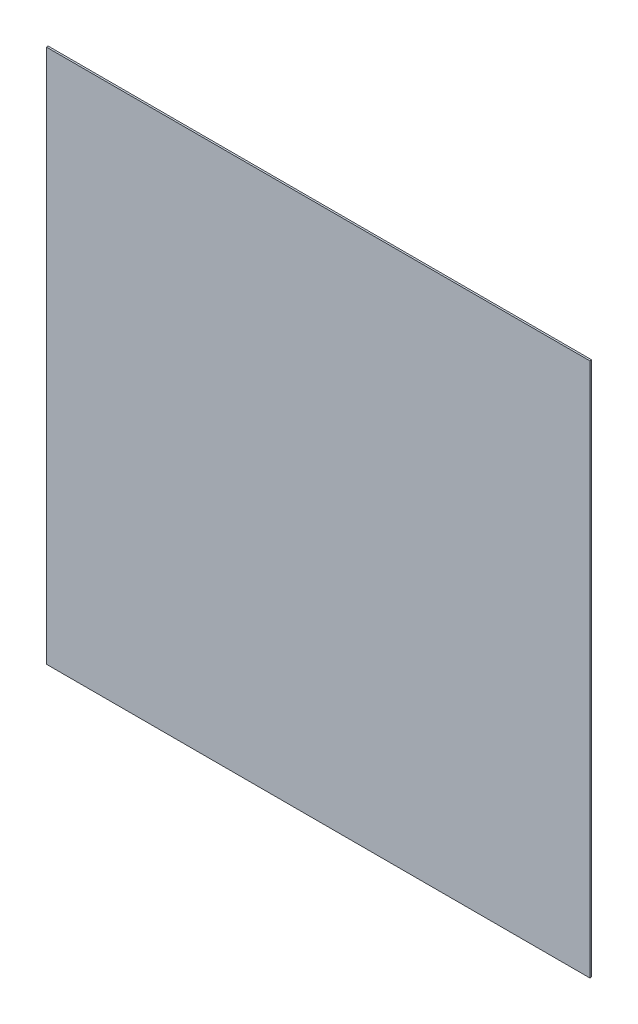
ISO-10303-21;
HEADER;
FILE_DESCRIPTION(('STEP AP214'),'2;1');
FILE_NAME('part.step','',(''),(''),'','','');
FILE_SCHEMA(('AUTOMOTIVE_DESIGN { 1 0 10303 214 1 1 1 1 }'));
ENDSEC;
DATA;
#1=APPLICATION_CONTEXT('core data for automotive mechanical design processes');
#2=APPLICATION_PROTOCOL_DEFINITION('international standard','automotive_design',2000,#1);
#3=PRODUCT_CONTEXT('',#1,'mechanical');
#4=PRODUCT('Part','Part','',(#3));
#5=PRODUCT_RELATED_PRODUCT_CATEGORY('part','',(#4));
#6=PRODUCT_DEFINITION_FORMATION('','',#4);
#7=PRODUCT_DEFINITION_CONTEXT('part definition',#1,'design');
#8=PRODUCT_DEFINITION('design','',#6,#7);
#9=PRODUCT_DEFINITION_SHAPE('','',#8);
#10=(LENGTH_UNIT() NAMED_UNIT(*) SI_UNIT(.MILLI.,.METRE.));
#11=(NAMED_UNIT(*) PLANE_ANGLE_UNIT() SI_UNIT($,.RADIAN.));
#12=(NAMED_UNIT(*) SI_UNIT($,.STERADIAN.) SOLID_ANGLE_UNIT());
#13=UNCERTAINTY_MEASURE_WITH_UNIT(LENGTH_MEASURE(1.E-05),#10,'distance_accuracy_value','');
#14=(GEOMETRIC_REPRESENTATION_CONTEXT(3) GLOBAL_UNCERTAINTY_ASSIGNED_CONTEXT((#13)) GLOBAL_UNIT_ASSIGNED_CONTEXT((#10,
#11,#12)) REPRESENTATION_CONTEXT('',''));
#15=CARTESIAN_POINT('',(0.,0.,0.));
#16=DIRECTION('',(0.,0.,1.));
#17=DIRECTION('',(1.,0.,0.));
#18=AXIS2_PLACEMENT_3D('',#15,#16,#17);
#19=CARTESIAN_POINT('',(0.,0.,2.));
#20=DIRECTION('',(1.,0.,0.));
#21=DIRECTION('',(0.,0.,-1.));
#22=AXIS2_PLACEMENT_3D('',#19,#20,#21);
#23=PLANE('',#22);
#24=DIRECTION('',(0.,-1.,0.));
#25=VECTOR('',#24,1.);
#26=CARTESIAN_POINT('',(0.,0.,0.));
#27=LINE('',#26,#25);
#28=CARTESIAN_POINT('',(0.,590.,0.));
#29=VERTEX_POINT('',#28);
#30=CARTESIAN_POINT('',(0.,0.,0.));
#31=VERTEX_POINT('',#30);
#32=EDGE_CURVE('E99',#29,#31,#27,.T.);
#33=ORIENTED_EDGE('',*,*,#32,.T.);
#34=DIRECTION('',(0.,0.,-1.));
#35=VECTOR('',#34,1.);
#36=CARTESIAN_POINT('',(0.,0.,2.));
#37=LINE('',#36,#35);
#38=CARTESIAN_POINT('',(0.,0.,2.));
#39=VERTEX_POINT('',#38);
#40=EDGE_CURVE('E11',#39,#31,#37,.T.);
#41=ORIENTED_EDGE('',*,*,#40,.F.);
#42=DIRECTION('',(0.,-1.,0.));
#43=VECTOR('',#42,1.);
#44=CARTESIAN_POINT('',(0.,0.,2.));
#45=LINE('',#44,#43);
#46=CARTESIAN_POINT('',(0.,590.,2.));
#47=VERTEX_POINT('',#46);
#48=EDGE_CURVE('E87',#47,#39,#45,.T.);
#49=ORIENTED_EDGE('',*,*,#48,.F.);
#50=DIRECTION('',(0.,0.,-1.));
#51=VECTOR('',#50,1.);
#52=CARTESIAN_POINT('',(0.,590.,2.));
#53=LINE('',#52,#51);
#54=EDGE_CURVE('E95',#47,#29,#53,.T.);
#55=ORIENTED_EDGE('',*,*,#54,.T.);
#56=EDGE_LOOP('',(#33,#41,#49,#55));
#57=FACE_BOUND('',#56,.T.);
#58=ADVANCED_FACE('F36',(#57),#23,.F.);
#59=CARTESIAN_POINT('',(0.,0.,2.));
#60=DIRECTION('',(0.,1.,0.));
#61=DIRECTION('',(0.,0.,1.));
#62=AXIS2_PLACEMENT_3D('',#59,#60,#61);
#63=PLANE('',#62);
#64=DIRECTION('',(1.,0.,0.));
#65=VECTOR('',#64,1.);
#66=CARTESIAN_POINT('',(0.,0.,0.));
#67=LINE('',#66,#65);
#68=CARTESIAN_POINT('',(600.,0.,0.));
#69=VERTEX_POINT('',#68);
#70=EDGE_CURVE('E91',#31,#69,#67,.T.);
#71=ORIENTED_EDGE('',*,*,#70,.T.);
#72=DIRECTION('',(0.,0.,-1.));
#73=VECTOR('',#72,1.);
#74=CARTESIAN_POINT('',(600.,0.,2.));
#75=LINE('',#74,#73);
#76=CARTESIAN_POINT('',(600.,0.,2.));
#77=VERTEX_POINT('',#76);
#78=EDGE_CURVE('E44',#77,#69,#75,.T.);
#79=ORIENTED_EDGE('',*,*,#78,.F.);
#80=DIRECTION('',(1.,0.,0.));
#81=VECTOR('',#80,1.);
#82=CARTESIAN_POINT('',(0.,0.,2.));
#83=LINE('',#82,#81);
#84=EDGE_CURVE('E82',#39,#77,#83,.T.);
#85=ORIENTED_EDGE('',*,*,#84,.F.);
#86=ORIENTED_EDGE('',*,*,#40,.T.);
#87=EDGE_LOOP('',(#71,#79,#85,#86));
#88=FACE_BOUND('',#87,.T.);
#89=ADVANCED_FACE('F90',(#88),#63,.F.);
#90=CARTESIAN_POINT('',(600.,0.,2.));
#91=DIRECTION('',(-1.,0.,0.));
#92=DIRECTION('',(0.,0.,1.));
#93=AXIS2_PLACEMENT_3D('',#90,#91,#92);
#94=PLANE('',#93);
#95=DIRECTION('',(0.,1.,0.));
#96=VECTOR('',#95,1.);
#97=CARTESIAN_POINT('',(600.,0.,0.));
#98=LINE('',#97,#96);
#99=CARTESIAN_POINT('',(600.,590.,0.));
#100=VERTEX_POINT('',#99);
#101=EDGE_CURVE('E69',#69,#100,#98,.T.);
#102=ORIENTED_EDGE('',*,*,#101,.T.);
#103=DIRECTION('',(0.,0.,-1.));
#104=VECTOR('',#103,1.);
#105=CARTESIAN_POINT('',(600.,590.,2.));
#106=LINE('',#105,#104);
#107=CARTESIAN_POINT('',(600.,590.,2.));
#108=VERTEX_POINT('',#107);
#109=EDGE_CURVE('E92',#108,#100,#106,.T.);
#110=ORIENTED_EDGE('',*,*,#109,.F.);
#111=DIRECTION('',(0.,1.,0.));
#112=VECTOR('',#111,1.);
#113=CARTESIAN_POINT('',(600.,0.,2.));
#114=LINE('',#113,#112);
#115=EDGE_CURVE('E85',#77,#108,#114,.T.);
#116=ORIENTED_EDGE('',*,*,#115,.F.);
#117=ORIENTED_EDGE('',*,*,#78,.T.);
#118=EDGE_LOOP('',(#102,#110,#116,#117));
#119=FACE_BOUND('',#118,.T.);
#120=ADVANCED_FACE('F93',(#119),#94,.F.);
#121=CARTESIAN_POINT('',(0.,590.,2.));
#122=DIRECTION('',(0.,-1.,0.));
#123=DIRECTION('',(0.,0.,-1.));
#124=AXIS2_PLACEMENT_3D('',#121,#122,#123);
#125=PLANE('',#124);
#126=DIRECTION('',(-1.,0.,0.));
#127=VECTOR('',#126,1.);
#128=CARTESIAN_POINT('',(0.,590.,0.));
#129=LINE('',#128,#127);
#130=EDGE_CURVE('E75',#100,#29,#129,.T.);
#131=ORIENTED_EDGE('',*,*,#130,.T.);
#132=ORIENTED_EDGE('',*,*,#54,.F.);
#133=DIRECTION('',(-1.,0.,0.));
#134=VECTOR('',#133,1.);
#135=CARTESIAN_POINT('',(0.,590.,2.));
#136=LINE('',#135,#134);
#137=EDGE_CURVE('E52',#108,#47,#136,.T.);
#138=ORIENTED_EDGE('',*,*,#137,.F.);
#139=ORIENTED_EDGE('',*,*,#109,.T.);
#140=EDGE_LOOP('',(#131,#132,#138,#139));
#141=FACE_BOUND('',#140,.T.);
#142=ADVANCED_FACE('F106',(#141),#125,.F.);
#143=CARTESIAN_POINT('',(0.,0.,2.));
#144=DIRECTION('',(0.,0.,-1.));
#145=DIRECTION('',(-1.,0.,0.));
#146=AXIS2_PLACEMENT_3D('',#143,#144,#145);
#147=PLANE('',#146);
#148=ORIENTED_EDGE('',*,*,#48,.T.);
#149=ORIENTED_EDGE('',*,*,#84,.T.);
#150=ORIENTED_EDGE('',*,*,#115,.T.);
#151=ORIENTED_EDGE('',*,*,#137,.T.);
#152=EDGE_LOOP('',(#148,#149,#150,#151));
#153=FACE_BOUND('',#152,.T.);
#154=ADVANCED_FACE('F83',(#153),#147,.F.);
#155=CARTESIAN_POINT('',(0.,0.,0.));
#156=DIRECTION('',(0.,0.,-1.));
#157=DIRECTION('',(-1.,0.,0.));
#158=AXIS2_PLACEMENT_3D('',#155,#156,#157);
#159=PLANE('',#158);
#160=ORIENTED_EDGE('',*,*,#32,.F.);
#161=ORIENTED_EDGE('',*,*,#130,.F.);
#162=ORIENTED_EDGE('',*,*,#101,.F.);
#163=ORIENTED_EDGE('',*,*,#70,.F.);
#164=EDGE_LOOP('',(#160,#161,#162,#163));
#165=FACE_BOUND('',#164,.T.);
#166=ADVANCED_FACE('F109',(#165),#159,.T.);
#167=CLOSED_SHELL('',(#58,#89,#120,#142,#154,#166));
#168=MANIFOLD_SOLID_BREP('B2',#167);
#169=ADVANCED_BREP_SHAPE_REPRESENTATION('',(#18,#168),#14);
#170=SHAPE_DEFINITION_REPRESENTATION(#9,#169);
ENDSEC;
END-ISO-10303-21;
